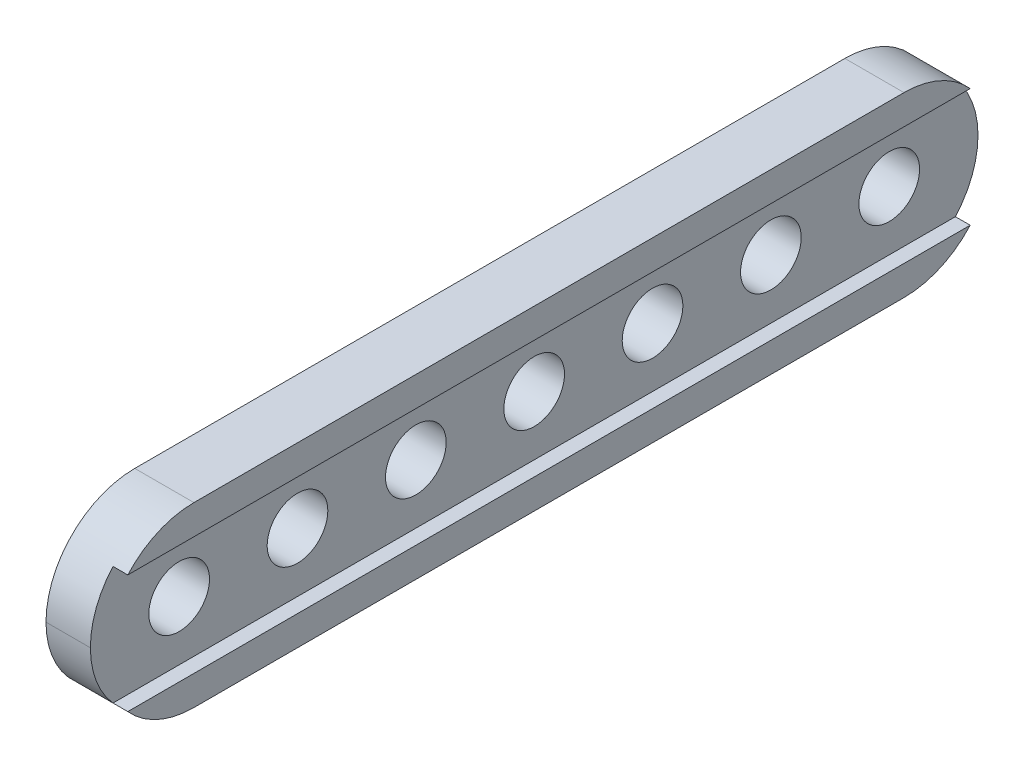
ISO-10303-21;
HEADER;
FILE_DESCRIPTION(('STEP AP214'),'2;1');
FILE_NAME('part.step','',(''),(''),'','','');
FILE_SCHEMA(('AUTOMOTIVE_DESIGN { 1 0 10303 214 1 1 1 1 }'));
ENDSEC;
DATA;
#1=APPLICATION_CONTEXT('core data for automotive mechanical design processes');
#2=APPLICATION_PROTOCOL_DEFINITION('international standard','automotive_design',2000,#1);
#3=PRODUCT_CONTEXT('',#1,'mechanical');
#4=PRODUCT('Part','Part','',(#3));
#5=PRODUCT_RELATED_PRODUCT_CATEGORY('part','',(#4));
#6=PRODUCT_DEFINITION_FORMATION('','',#4);
#7=PRODUCT_DEFINITION_CONTEXT('part definition',#1,'design');
#8=PRODUCT_DEFINITION('design','',#6,#7);
#9=PRODUCT_DEFINITION_SHAPE('','',#8);
#10=(LENGTH_UNIT() NAMED_UNIT(*) SI_UNIT(.MILLI.,.METRE.));
#11=(NAMED_UNIT(*) PLANE_ANGLE_UNIT() SI_UNIT($,.RADIAN.));
#12=(NAMED_UNIT(*) SI_UNIT($,.STERADIAN.) SOLID_ANGLE_UNIT());
#13=UNCERTAINTY_MEASURE_WITH_UNIT(LENGTH_MEASURE(1.E-05),#10,'distance_accuracy_value','');
#14=(GEOMETRIC_REPRESENTATION_CONTEXT(3) GLOBAL_UNCERTAINTY_ASSIGNED_CONTEXT((#13)) GLOBAL_UNIT_ASSIGNED_CONTEXT((#10,
#11,#12)) REPRESENTATION_CONTEXT('',''));
#15=CARTESIAN_POINT('',(0.,0.,0.));
#16=DIRECTION('',(0.,0.,1.));
#17=DIRECTION('',(1.,0.,0.));
#18=AXIS2_PLACEMENT_3D('',#15,#16,#17);
#19=CARTESIAN_POINT('',(0.,0.,-60.));
#20=DIRECTION('',(-1.,0.,0.));
#21=DIRECTION('',(0.,-1.,0.));
#22=AXIS2_PLACEMENT_3D('',#19,#20,#21);
#23=PLANE('',#22);
#24=CARTESIAN_POINT('',(0.,6.,-30.));
#25=DIRECTION('',(-1.,0.,0.));
#26=DIRECTION('',(0.,-1.,0.));
#27=AXIS2_PLACEMENT_3D('',#24,#25,#26);
#28=CIRCLE('',#27,2.05);
#29=CARTESIAN_POINT('',(0.,3.95,-30.));
#30=VERTEX_POINT('',#29);
#31=EDGE_CURVE('E11',#30,#30,#28,.T.);
#32=ORIENTED_EDGE('',*,*,#31,.F.);
#33=EDGE_LOOP('',(#32));
#34=FACE_BOUND('',#33,.T.);
#35=CARTESIAN_POINT('',(0.,6.,-38.));
#36=DIRECTION('',(-1.,0.,0.));
#37=DIRECTION('',(0.,-1.,0.));
#38=AXIS2_PLACEMENT_3D('',#35,#36,#37);
#39=CIRCLE('',#38,2.05);
#40=CARTESIAN_POINT('',(0.,3.95,-38.));
#41=VERTEX_POINT('',#40);
#42=EDGE_CURVE('E182',#41,#41,#39,.T.);
#43=ORIENTED_EDGE('',*,*,#42,.F.);
#44=EDGE_LOOP('',(#43));
#45=FACE_BOUND('',#44,.T.);
#46=CARTESIAN_POINT('',(0.,6.,-6.));
#47=DIRECTION('',(-1.,0.,0.));
#48=DIRECTION('',(0.,-1.,0.));
#49=AXIS2_PLACEMENT_3D('',#46,#47,#48);
#50=CIRCLE('',#49,6.);
#51=CARTESIAN_POINT('',(0.,0.,-6.));
#52=VERTEX_POINT('',#51);
#53=CARTESIAN_POINT('',(0.,6.,0.));
#54=VERTEX_POINT('',#53);
#55=EDGE_CURVE('E115',#52,#54,#50,.T.);
#56=ORIENTED_EDGE('',*,*,#55,.T.);
#57=CARTESIAN_POINT('',(0.,6.,-6.));
#58=DIRECTION('',(-1.,0.,0.));
#59=DIRECTION('',(0.,-1.,0.));
#60=AXIS2_PLACEMENT_3D('',#57,#58,#59);
#61=CIRCLE('',#60,6.);
#62=CARTESIAN_POINT('',(0.,12.,-6.));
#63=VERTEX_POINT('',#62);
#64=EDGE_CURVE('E120',#54,#63,#61,.T.);
#65=ORIENTED_EDGE('',*,*,#64,.T.);
#66=DIRECTION('',(0.,0.,1.));
#67=VECTOR('',#66,1.);
#68=CARTESIAN_POINT('',(0.,12.,-60.));
#69=LINE('',#68,#67);
#70=CARTESIAN_POINT('',(0.,12.,-54.));
#71=VERTEX_POINT('',#70);
#72=EDGE_CURVE('E213',#71,#63,#69,.T.);
#73=ORIENTED_EDGE('',*,*,#72,.F.);
#74=CARTESIAN_POINT('',(0.,6.,-54.));
#75=DIRECTION('',(-1.,0.,0.));
#76=DIRECTION('',(0.,-1.,0.));
#77=AXIS2_PLACEMENT_3D('',#74,#75,#76);
#78=CIRCLE('',#77,6.);
#79=CARTESIAN_POINT('',(0.,6.,-60.));
#80=VERTEX_POINT('',#79);
#81=EDGE_CURVE('E215',#71,#80,#78,.T.);
#82=ORIENTED_EDGE('',*,*,#81,.T.);
#83=CARTESIAN_POINT('',(0.,6.,-54.));
#84=DIRECTION('',(-1.,0.,0.));
#85=DIRECTION('',(0.,-1.,0.));
#86=AXIS2_PLACEMENT_3D('',#83,#84,#85);
#87=CIRCLE('',#86,6.);
#88=CARTESIAN_POINT('',(0.,0.,-54.));
#89=VERTEX_POINT('',#88);
#90=EDGE_CURVE('E126',#80,#89,#87,.T.);
#91=ORIENTED_EDGE('',*,*,#90,.T.);
#92=DIRECTION('',(0.,0.,1.));
#93=VECTOR('',#92,1.);
#94=CARTESIAN_POINT('',(0.,0.,-60.));
#95=LINE('',#94,#93);
#96=EDGE_CURVE('E123',#89,#52,#95,.T.);
#97=ORIENTED_EDGE('',*,*,#96,.T.);
#98=EDGE_LOOP('',(#56,#65,#73,#82,#91,#97));
#99=FACE_BOUND('',#98,.T.);
#100=CARTESIAN_POINT('',(0.,6.,-54.));
#101=DIRECTION('',(-1.,0.,0.));
#102=DIRECTION('',(0.,-1.,0.));
#103=AXIS2_PLACEMENT_3D('',#100,#101,#102);
#104=CIRCLE('',#103,2.05);
#105=CARTESIAN_POINT('',(0.,3.95,-54.));
#106=VERTEX_POINT('',#105);
#107=EDGE_CURVE('E179',#106,#106,#104,.T.);
#108=ORIENTED_EDGE('',*,*,#107,.F.);
#109=EDGE_LOOP('',(#108));
#110=FACE_BOUND('',#109,.T.);
#111=CARTESIAN_POINT('',(0.,6.,-46.));
#112=DIRECTION('',(-1.,0.,0.));
#113=DIRECTION('',(0.,-1.,0.));
#114=AXIS2_PLACEMENT_3D('',#111,#112,#113);
#115=CIRCLE('',#114,2.05);
#116=CARTESIAN_POINT('',(0.,3.95,-46.));
#117=VERTEX_POINT('',#116);
#118=EDGE_CURVE('E208',#117,#117,#115,.T.);
#119=ORIENTED_EDGE('',*,*,#118,.F.);
#120=EDGE_LOOP('',(#119));
#121=FACE_BOUND('',#120,.T.);
#122=CARTESIAN_POINT('',(0.,6.,-6.));
#123=DIRECTION('',(1.,0.,0.));
#124=DIRECTION('',(0.,-1.,0.));
#125=AXIS2_PLACEMENT_3D('',#122,#123,#124);
#126=CIRCLE('',#125,2.05);
#127=CARTESIAN_POINT('',(0.,3.95,-6.));
#128=VERTEX_POINT('',#127);
#129=EDGE_CURVE('E190',#128,#128,#126,.T.);
#130=ORIENTED_EDGE('',*,*,#129,.T.);
#131=EDGE_LOOP('',(#130));
#132=FACE_BOUND('',#131,.T.);
#133=CARTESIAN_POINT('',(0.,6.,-14.));
#134=DIRECTION('',(1.,0.,0.));
#135=DIRECTION('',(0.,-1.,0.));
#136=AXIS2_PLACEMENT_3D('',#133,#134,#135);
#137=CIRCLE('',#136,2.05);
#138=CARTESIAN_POINT('',(0.,3.95,-14.));
#139=VERTEX_POINT('',#138);
#140=EDGE_CURVE('E193',#139,#139,#137,.T.);
#141=ORIENTED_EDGE('',*,*,#140,.T.);
#142=EDGE_LOOP('',(#141));
#143=FACE_BOUND('',#142,.T.);
#144=CARTESIAN_POINT('',(0.,6.,-22.));
#145=DIRECTION('',(1.,0.,0.));
#146=DIRECTION('',(0.,-1.,0.));
#147=AXIS2_PLACEMENT_3D('',#144,#145,#146);
#148=CIRCLE('',#147,2.05);
#149=CARTESIAN_POINT('',(0.,3.95,-22.));
#150=VERTEX_POINT('',#149);
#151=EDGE_CURVE('E203',#150,#150,#148,.T.);
#152=ORIENTED_EDGE('',*,*,#151,.T.);
#153=EDGE_LOOP('',(#152));
#154=FACE_BOUND('',#153,.T.);
#155=ADVANCED_FACE('F33',(#34,#45,#99,#110,#121,#132,#143,#154),#23,.T.);
#156=CARTESIAN_POINT('',(3.,10.,-60.));
#157=DIRECTION('',(1.,0.,0.));
#158=DIRECTION('',(0.,1.,0.));
#159=AXIS2_PLACEMENT_3D('',#156,#157,#158);
#160=PLANE('',#159);
#161=CARTESIAN_POINT('',(3.,6.,-30.));
#162=DIRECTION('',(1.,0.,0.));
#163=DIRECTION('',(0.,1.,0.));
#164=AXIS2_PLACEMENT_3D('',#161,#162,#163);
#165=CIRCLE('',#164,2.05);
#166=CARTESIAN_POINT('',(3.,8.05,-30.));
#167=VERTEX_POINT('',#166);
#168=EDGE_CURVE('E42',#167,#167,#165,.T.);
#169=ORIENTED_EDGE('',*,*,#168,.F.);
#170=EDGE_LOOP('',(#169));
#171=FACE_BOUND('',#170,.T.);
#172=CARTESIAN_POINT('',(3.,6.,-38.));
#173=DIRECTION('',(1.,0.,0.));
#174=DIRECTION('',(0.,1.,0.));
#175=AXIS2_PLACEMENT_3D('',#172,#173,#174);
#176=CIRCLE('',#175,2.05);
#177=CARTESIAN_POINT('',(3.,8.05,-38.));
#178=VERTEX_POINT('',#177);
#179=EDGE_CURVE('E172',#178,#178,#176,.T.);
#180=ORIENTED_EDGE('',*,*,#179,.F.);
#181=EDGE_LOOP('',(#180));
#182=FACE_BOUND('',#181,.T.);
#183=DIRECTION('',(0.,0.,1.));
#184=VECTOR('',#183,1.);
#185=CARTESIAN_POINT('',(3.,10.,-60.));
#186=LINE('',#185,#184);
#187=CARTESIAN_POINT('',(3.,10.,-58.4721359549996));
#188=VERTEX_POINT('',#187);
#189=CARTESIAN_POINT('',(3.,10.,-1.52786404500042));
#190=VERTEX_POINT('',#189);
#191=EDGE_CURVE('E222',#188,#190,#186,.T.);
#192=ORIENTED_EDGE('',*,*,#191,.T.);
#193=CARTESIAN_POINT('',(3.,6.,-6.));
#194=DIRECTION('',(1.,0.,0.));
#195=DIRECTION('',(0.,1.,0.));
#196=AXIS2_PLACEMENT_3D('',#193,#194,#195);
#197=CIRCLE('',#196,6.);
#198=CARTESIAN_POINT('',(3.,6.,0.));
#199=VERTEX_POINT('',#198);
#200=EDGE_CURVE('E161',#190,#199,#197,.T.);
#201=ORIENTED_EDGE('',*,*,#200,.T.);
#202=CARTESIAN_POINT('',(3.,6.,-6.));
#203=DIRECTION('',(1.,0.,0.));
#204=DIRECTION('',(0.,1.,0.));
#205=AXIS2_PLACEMENT_3D('',#202,#203,#204);
#206=CIRCLE('',#205,6.);
#207=CARTESIAN_POINT('',(3.,2.,-1.52786404500042));
#208=VERTEX_POINT('',#207);
#209=EDGE_CURVE('E133',#199,#208,#206,.T.);
#210=ORIENTED_EDGE('',*,*,#209,.T.);
#211=DIRECTION('',(0.,0.,1.));
#212=VECTOR('',#211,1.);
#213=CARTESIAN_POINT('',(3.,2.,-60.));
#214=LINE('',#213,#212);
#215=CARTESIAN_POINT('',(3.,2.,-58.4721359549996));
#216=VERTEX_POINT('',#215);
#217=EDGE_CURVE('E225',#216,#208,#214,.T.);
#218=ORIENTED_EDGE('',*,*,#217,.F.);
#219=CARTESIAN_POINT('',(3.,6.,-54.));
#220=DIRECTION('',(1.,0.,0.));
#221=DIRECTION('',(0.,1.,0.));
#222=AXIS2_PLACEMENT_3D('',#219,#220,#221);
#223=CIRCLE('',#222,6.);
#224=CARTESIAN_POINT('',(3.,6.,-60.));
#225=VERTEX_POINT('',#224);
#226=EDGE_CURVE('E158',#216,#225,#223,.T.);
#227=ORIENTED_EDGE('',*,*,#226,.T.);
#228=CARTESIAN_POINT('',(3.,6.,-54.));
#229=DIRECTION('',(1.,0.,0.));
#230=DIRECTION('',(0.,1.,0.));
#231=AXIS2_PLACEMENT_3D('',#228,#229,#230);
#232=CIRCLE('',#231,6.);
#233=EDGE_CURVE('E156',#225,#188,#232,.T.);
#234=ORIENTED_EDGE('',*,*,#233,.T.);
#235=EDGE_LOOP('',(#192,#201,#210,#218,#227,#234));
#236=FACE_BOUND('',#235,.T.);
#237=CARTESIAN_POINT('',(3.,6.,-54.));
#238=DIRECTION('',(1.,0.,0.));
#239=DIRECTION('',(0.,1.,0.));
#240=AXIS2_PLACEMENT_3D('',#237,#238,#239);
#241=CIRCLE('',#240,2.05);
#242=CARTESIAN_POINT('',(3.,8.05,-54.));
#243=VERTEX_POINT('',#242);
#244=EDGE_CURVE('E176',#243,#243,#241,.T.);
#245=ORIENTED_EDGE('',*,*,#244,.F.);
#246=EDGE_LOOP('',(#245));
#247=FACE_BOUND('',#246,.T.);
#248=CARTESIAN_POINT('',(3.,6.,-46.));
#249=DIRECTION('',(1.,0.,0.));
#250=DIRECTION('',(0.,1.,0.));
#251=AXIS2_PLACEMENT_3D('',#248,#249,#250);
#252=CIRCLE('',#251,2.05);
#253=CARTESIAN_POINT('',(3.,8.05,-46.));
#254=VERTEX_POINT('',#253);
#255=EDGE_CURVE('E189',#254,#254,#252,.T.);
#256=ORIENTED_EDGE('',*,*,#255,.F.);
#257=EDGE_LOOP('',(#256));
#258=FACE_BOUND('',#257,.T.);
#259=CARTESIAN_POINT('',(3.,6.,-6.));
#260=DIRECTION('',(1.,0.,0.));
#261=DIRECTION('',(0.,1.,0.));
#262=AXIS2_PLACEMENT_3D('',#259,#260,#261);
#263=CIRCLE('',#262,2.05);
#264=CARTESIAN_POINT('',(3.,8.05,-6.));
#265=VERTEX_POINT('',#264);
#266=EDGE_CURVE('E187',#265,#265,#263,.F.);
#267=ORIENTED_EDGE('',*,*,#266,.T.);
#268=EDGE_LOOP('',(#267));
#269=FACE_BOUND('',#268,.T.);
#270=CARTESIAN_POINT('',(3.,6.,-14.));
#271=DIRECTION('',(1.,0.,0.));
#272=DIRECTION('',(0.,1.,0.));
#273=AXIS2_PLACEMENT_3D('',#270,#271,#272);
#274=CIRCLE('',#273,2.05);
#275=CARTESIAN_POINT('',(3.,8.05,-14.));
#276=VERTEX_POINT('',#275);
#277=EDGE_CURVE('E191',#276,#276,#274,.F.);
#278=ORIENTED_EDGE('',*,*,#277,.T.);
#279=EDGE_LOOP('',(#278));
#280=FACE_BOUND('',#279,.T.);
#281=CARTESIAN_POINT('',(3.,6.,-22.));
#282=DIRECTION('',(1.,0.,0.));
#283=DIRECTION('',(0.,1.,0.));
#284=AXIS2_PLACEMENT_3D('',#281,#282,#283);
#285=CIRCLE('',#284,2.05);
#286=CARTESIAN_POINT('',(3.,8.05,-22.));
#287=VERTEX_POINT('',#286);
#288=EDGE_CURVE('E37',#287,#287,#285,.F.);
#289=ORIENTED_EDGE('',*,*,#288,.T.);
#290=EDGE_LOOP('',(#289));
#291=FACE_BOUND('',#290,.T.);
#292=ADVANCED_FACE('F254',(#171,#182,#236,#247,#258,#269,#280,#291),#160,.T.);
#293=CARTESIAN_POINT('',(4.,6.,-30.));
#294=DIRECTION('',(-1.,0.,0.));
#295=DIRECTION('',(0.,-1.,0.));
#296=AXIS2_PLACEMENT_3D('',#293,#294,#295);
#297=CYLINDRICAL_SURFACE('',#296,2.05);
#298=ORIENTED_EDGE('',*,*,#168,.T.);
#299=EDGE_LOOP('',(#298));
#300=FACE_BOUND('',#299,.T.);
#301=ORIENTED_EDGE('',*,*,#31,.T.);
#302=EDGE_LOOP('',(#301));
#303=FACE_BOUND('',#302,.T.);
#304=ADVANCED_FACE('F35',(#300,#303),#297,.F.);
#305=CARTESIAN_POINT('',(4.,6.,-38.));
#306=DIRECTION('',(-1.,0.,0.));
#307=DIRECTION('',(0.,-1.,0.));
#308=AXIS2_PLACEMENT_3D('',#305,#306,#307);
#309=CYLINDRICAL_SURFACE('',#308,2.05);
#310=ORIENTED_EDGE('',*,*,#179,.T.);
#311=EDGE_LOOP('',(#310));
#312=FACE_BOUND('',#311,.T.);
#313=ORIENTED_EDGE('',*,*,#42,.T.);
#314=EDGE_LOOP('',(#313));
#315=FACE_BOUND('',#314,.T.);
#316=ADVANCED_FACE('F293',(#312,#315),#309,.F.);
#317=CARTESIAN_POINT('',(0.,12.,-60.));
#318=DIRECTION('',(0.,1.,0.));
#319=DIRECTION('',(0.,0.,1.));
#320=AXIS2_PLACEMENT_3D('',#317,#318,#319);
#321=PLANE('',#320);
#322=ORIENTED_EDGE('',*,*,#72,.T.);
#323=DIRECTION('',(-1.,0.,0.));
#324=VECTOR('',#323,1.);
#325=CARTESIAN_POINT('',(4.,12.,-6.));
#326=LINE('',#325,#324);
#327=CARTESIAN_POINT('',(4.,12.,-6.));
#328=VERTEX_POINT('',#327);
#329=EDGE_CURVE('E141',#63,#328,#326,.F.);
#330=ORIENTED_EDGE('',*,*,#329,.T.);
#331=DIRECTION('',(0.,0.,1.));
#332=VECTOR('',#331,1.);
#333=CARTESIAN_POINT('',(4.,12.,-60.));
#334=LINE('',#333,#332);
#335=CARTESIAN_POINT('',(4.,12.,-54.));
#336=VERTEX_POINT('',#335);
#337=EDGE_CURVE('E216',#336,#328,#334,.T.);
#338=ORIENTED_EDGE('',*,*,#337,.F.);
#339=DIRECTION('',(-1.,0.,0.));
#340=VECTOR('',#339,1.);
#341=CARTESIAN_POINT('',(0.,12.,-54.));
#342=LINE('',#341,#340);
#343=EDGE_CURVE('E142',#336,#71,#342,.T.);
#344=ORIENTED_EDGE('',*,*,#343,.T.);
#345=EDGE_LOOP('',(#322,#330,#338,#344));
#346=FACE_BOUND('',#345,.T.);
#347=ADVANCED_FACE('F290',(#346),#321,.T.);
#348=CARTESIAN_POINT('',(4.,10.,-60.));
#349=DIRECTION('',(1.,0.,0.));
#350=DIRECTION('',(0.,1.,0.));
#351=AXIS2_PLACEMENT_3D('',#348,#349,#350);
#352=PLANE('',#351);
#353=ORIENTED_EDGE('',*,*,#337,.T.);
#354=CARTESIAN_POINT('',(4.,6.,-6.));
#355=DIRECTION('',(1.,0.,0.));
#356=DIRECTION('',(0.,1.,0.));
#357=AXIS2_PLACEMENT_3D('',#354,#355,#356);
#358=CIRCLE('',#357,6.);
#359=CARTESIAN_POINT('',(4.,10.,-1.52786404500042));
#360=VERTEX_POINT('',#359);
#361=EDGE_CURVE('E150',#328,#360,#358,.T.);
#362=ORIENTED_EDGE('',*,*,#361,.T.);
#363=DIRECTION('',(0.,0.,1.));
#364=VECTOR('',#363,1.);
#365=CARTESIAN_POINT('',(4.,10.,-60.));
#366=LINE('',#365,#364);
#367=CARTESIAN_POINT('',(4.,10.,-58.4721359549996));
#368=VERTEX_POINT('',#367);
#369=EDGE_CURVE('E219',#368,#360,#366,.T.);
#370=ORIENTED_EDGE('',*,*,#369,.F.);
#371=CARTESIAN_POINT('',(4.,6.,-54.));
#372=DIRECTION('',(1.,0.,0.));
#373=DIRECTION('',(0.,1.,0.));
#374=AXIS2_PLACEMENT_3D('',#371,#372,#373);
#375=CIRCLE('',#374,6.);
#376=EDGE_CURVE('E148',#368,#336,#375,.T.);
#377=ORIENTED_EDGE('',*,*,#376,.T.);
#378=EDGE_LOOP('',(#353,#362,#370,#377));
#379=FACE_BOUND('',#378,.T.);
#380=ADVANCED_FACE('F286',(#379),#352,.T.);
#381=CARTESIAN_POINT('',(4.,10.,-60.));
#382=DIRECTION('',(0.,-1.,0.));
#383=DIRECTION('',(1.,0.,0.));
#384=AXIS2_PLACEMENT_3D('',#381,#382,#383);
#385=PLANE('',#384);
#386=ORIENTED_EDGE('',*,*,#369,.T.);
#387=DIRECTION('',(1.,0.,0.));
#388=VECTOR('',#387,1.);
#389=CARTESIAN_POINT('',(4.,10.,-1.52786404500042));
#390=LINE('',#389,#388);
#391=EDGE_CURVE('E154',#360,#190,#390,.F.);
#392=ORIENTED_EDGE('',*,*,#391,.T.);
#393=ORIENTED_EDGE('',*,*,#191,.F.);
#394=DIRECTION('',(-1.,0.,0.));
#395=VECTOR('',#394,1.);
#396=CARTESIAN_POINT('',(3.,10.,-58.4721359549996));
#397=LINE('',#396,#395);
#398=EDGE_CURVE('E152',#188,#368,#397,.F.);
#399=ORIENTED_EDGE('',*,*,#398,.T.);
#400=EDGE_LOOP('',(#386,#392,#393,#399));
#401=FACE_BOUND('',#400,.T.);
#402=ADVANCED_FACE('F280',(#401),#385,.T.);
#403=CARTESIAN_POINT('',(4.,2.,-60.));
#404=DIRECTION('',(0.,1.,0.));
#405=DIRECTION('',(-1.,0.,0.));
#406=AXIS2_PLACEMENT_3D('',#403,#404,#405);
#407=PLANE('',#406);
#408=ORIENTED_EDGE('',*,*,#217,.T.);
#409=DIRECTION('',(-1.,0.,0.));
#410=VECTOR('',#409,1.);
#411=CARTESIAN_POINT('',(3.,2.,-1.52786404500042));
#412=LINE('',#411,#410);
#413=CARTESIAN_POINT('',(4.,2.,-1.52786404500042));
#414=VERTEX_POINT('',#413);
#415=EDGE_CURVE('E165',#208,#414,#412,.F.);
#416=ORIENTED_EDGE('',*,*,#415,.T.);
#417=DIRECTION('',(0.,0.,1.));
#418=VECTOR('',#417,1.);
#419=CARTESIAN_POINT('',(4.,2.,-60.));
#420=LINE('',#419,#418);
#421=CARTESIAN_POINT('',(4.,2.,-58.4721359549996));
#422=VERTEX_POINT('',#421);
#423=EDGE_CURVE('E228',#422,#414,#420,.T.);
#424=ORIENTED_EDGE('',*,*,#423,.F.);
#425=DIRECTION('',(1.,0.,0.));
#426=VECTOR('',#425,1.);
#427=CARTESIAN_POINT('',(4.,2.,-58.4721359549996));
#428=LINE('',#427,#426);
#429=EDGE_CURVE('E163',#422,#216,#428,.F.);
#430=ORIENTED_EDGE('',*,*,#429,.T.);
#431=EDGE_LOOP('',(#408,#416,#424,#430));
#432=FACE_BOUND('',#431,.T.);
#433=ADVANCED_FACE('F276',(#432),#407,.T.);
#434=CARTESIAN_POINT('',(4.,0.,-60.));
#435=DIRECTION('',(1.,0.,0.));
#436=DIRECTION('',(0.,1.,0.));
#437=AXIS2_PLACEMENT_3D('',#434,#435,#436);
#438=PLANE('',#437);
#439=ORIENTED_EDGE('',*,*,#423,.T.);
#440=CARTESIAN_POINT('',(4.,6.,-6.));
#441=DIRECTION('',(1.,0.,0.));
#442=DIRECTION('',(0.,1.,0.));
#443=AXIS2_PLACEMENT_3D('',#440,#441,#442);
#444=CIRCLE('',#443,6.);
#445=CARTESIAN_POINT('',(4.,0.,-6.));
#446=VERTEX_POINT('',#445);
#447=EDGE_CURVE('E50',#414,#446,#444,.T.);
#448=ORIENTED_EDGE('',*,*,#447,.T.);
#449=DIRECTION('',(0.,0.,1.));
#450=VECTOR('',#449,1.);
#451=CARTESIAN_POINT('',(4.,0.,-60.));
#452=LINE('',#451,#450);
#453=CARTESIAN_POINT('',(4.,0.,-54.));
#454=VERTEX_POINT('',#453);
#455=EDGE_CURVE('E230',#454,#446,#452,.T.);
#456=ORIENTED_EDGE('',*,*,#455,.F.);
#457=CARTESIAN_POINT('',(4.,6.,-54.));
#458=DIRECTION('',(1.,0.,0.));
#459=DIRECTION('',(0.,1.,0.));
#460=AXIS2_PLACEMENT_3D('',#457,#458,#459);
#461=CIRCLE('',#460,6.);
#462=EDGE_CURVE('E58',#454,#422,#461,.T.);
#463=ORIENTED_EDGE('',*,*,#462,.T.);
#464=EDGE_LOOP('',(#439,#448,#456,#463));
#465=FACE_BOUND('',#464,.T.);
#466=ADVANCED_FACE('F272',(#465),#438,.T.);
#467=CARTESIAN_POINT('',(0.,0.,-60.));
#468=DIRECTION('',(0.,-1.,0.));
#469=DIRECTION('',(0.,0.,-1.));
#470=AXIS2_PLACEMENT_3D('',#467,#468,#469);
#471=PLANE('',#470);
#472=ORIENTED_EDGE('',*,*,#455,.T.);
#473=DIRECTION('',(1.,0.,0.));
#474=VECTOR('',#473,1.);
#475=CARTESIAN_POINT('',(0.,0.,-6.));
#476=LINE('',#475,#474);
#477=EDGE_CURVE('E171',#446,#52,#476,.F.);
#478=ORIENTED_EDGE('',*,*,#477,.T.);
#479=ORIENTED_EDGE('',*,*,#96,.F.);
#480=DIRECTION('',(1.,0.,0.));
#481=VECTOR('',#480,1.);
#482=CARTESIAN_POINT('',(0.,0.,-54.));
#483=LINE('',#482,#481);
#484=EDGE_CURVE('E169',#89,#454,#483,.T.);
#485=ORIENTED_EDGE('',*,*,#484,.T.);
#486=EDGE_LOOP('',(#472,#478,#479,#485));
#487=FACE_BOUND('',#486,.T.);
#488=ADVANCED_FACE('F237',(#487),#471,.T.);
#489=CARTESIAN_POINT('',(0.,6.,-6.));
#490=DIRECTION('',(-1.,0.,0.));
#491=DIRECTION('',(0.,0.,1.));
#492=AXIS2_PLACEMENT_3D('',#489,#490,#491);
#493=CYLINDRICAL_SURFACE('',#492,6.);
#494=ORIENTED_EDGE('',*,*,#415,.F.);
#495=ORIENTED_EDGE('',*,*,#209,.F.);
#496=DIRECTION('',(1.,0.,0.));
#497=VECTOR('',#496,1.);
#498=CARTESIAN_POINT('',(4.,6.,0.));
#499=LINE('',#498,#497);
#500=EDGE_CURVE('E130',#54,#199,#499,.T.);
#501=ORIENTED_EDGE('',*,*,#500,.F.);
#502=ORIENTED_EDGE('',*,*,#55,.F.);
#503=ORIENTED_EDGE('',*,*,#477,.F.);
#504=ORIENTED_EDGE('',*,*,#447,.F.);
#505=EDGE_LOOP('',(#494,#495,#501,#502,#503,#504));
#506=FACE_BOUND('',#505,.T.);
#507=ADVANCED_FACE('F132',(#506),#493,.T.);
#508=CARTESIAN_POINT('',(0.,6.,-6.));
#509=DIRECTION('',(1.,0.,0.));
#510=DIRECTION('',(0.,0.,-1.));
#511=AXIS2_PLACEMENT_3D('',#508,#509,#510);
#512=CYLINDRICAL_SURFACE('',#511,6.);
#513=ORIENTED_EDGE('',*,*,#361,.F.);
#514=ORIENTED_EDGE('',*,*,#329,.F.);
#515=ORIENTED_EDGE('',*,*,#64,.F.);
#516=ORIENTED_EDGE('',*,*,#500,.T.);
#517=ORIENTED_EDGE('',*,*,#200,.F.);
#518=ORIENTED_EDGE('',*,*,#391,.F.);
#519=EDGE_LOOP('',(#513,#514,#515,#516,#517,#518));
#520=FACE_BOUND('',#519,.T.);
#521=ADVANCED_FACE('F139',(#520),#512,.T.);
#522=CARTESIAN_POINT('',(0.,6.,-54.));
#523=DIRECTION('',(-1.,0.,0.));
#524=DIRECTION('',(0.,0.,1.));
#525=AXIS2_PLACEMENT_3D('',#522,#523,#524);
#526=CYLINDRICAL_SURFACE('',#525,6.);
#527=DIRECTION('',(-1.,0.,0.));
#528=VECTOR('',#527,1.);
#529=CARTESIAN_POINT('',(0.,6.,-60.));
#530=LINE('',#529,#528);
#531=EDGE_CURVE('E136',#80,#225,#530,.F.);
#532=ORIENTED_EDGE('',*,*,#531,.F.);
#533=ORIENTED_EDGE('',*,*,#81,.F.);
#534=ORIENTED_EDGE('',*,*,#343,.F.);
#535=ORIENTED_EDGE('',*,*,#376,.F.);
#536=ORIENTED_EDGE('',*,*,#398,.F.);
#537=ORIENTED_EDGE('',*,*,#233,.F.);
#538=EDGE_LOOP('',(#532,#533,#534,#535,#536,#537));
#539=FACE_BOUND('',#538,.T.);
#540=ADVANCED_FACE('F241',(#539),#526,.T.);
#541=CARTESIAN_POINT('',(0.,6.,-54.));
#542=DIRECTION('',(1.,0.,0.));
#543=DIRECTION('',(0.,0.,-1.));
#544=AXIS2_PLACEMENT_3D('',#541,#542,#543);
#545=CYLINDRICAL_SURFACE('',#544,6.);
#546=ORIENTED_EDGE('',*,*,#90,.F.);
#547=ORIENTED_EDGE('',*,*,#531,.T.);
#548=ORIENTED_EDGE('',*,*,#226,.F.);
#549=ORIENTED_EDGE('',*,*,#429,.F.);
#550=ORIENTED_EDGE('',*,*,#462,.F.);
#551=ORIENTED_EDGE('',*,*,#484,.F.);
#552=EDGE_LOOP('',(#546,#547,#548,#549,#550,#551));
#553=FACE_BOUND('',#552,.T.);
#554=ADVANCED_FACE('F238',(#553),#545,.T.);
#555=CARTESIAN_POINT('',(4.,6.,-54.));
#556=DIRECTION('',(-1.,0.,0.));
#557=DIRECTION('',(0.,-1.,0.));
#558=AXIS2_PLACEMENT_3D('',#555,#556,#557);
#559=CYLINDRICAL_SURFACE('',#558,2.05);
#560=ORIENTED_EDGE('',*,*,#244,.T.);
#561=EDGE_LOOP('',(#560));
#562=FACE_BOUND('',#561,.T.);
#563=ORIENTED_EDGE('',*,*,#107,.T.);
#564=EDGE_LOOP('',(#563));
#565=FACE_BOUND('',#564,.T.);
#566=ADVANCED_FACE('F240',(#562,#565),#559,.F.);
#567=CARTESIAN_POINT('',(4.,6.,-46.));
#568=DIRECTION('',(-1.,0.,0.));
#569=DIRECTION('',(0.,-1.,0.));
#570=AXIS2_PLACEMENT_3D('',#567,#568,#569);
#571=CYLINDRICAL_SURFACE('',#570,2.05);
#572=ORIENTED_EDGE('',*,*,#255,.T.);
#573=EDGE_LOOP('',(#572));
#574=FACE_BOUND('',#573,.T.);
#575=ORIENTED_EDGE('',*,*,#118,.T.);
#576=EDGE_LOOP('',(#575));
#577=FACE_BOUND('',#576,.T.);
#578=ADVANCED_FACE('F247',(#574,#577),#571,.F.);
#579=CARTESIAN_POINT('',(4.,6.,-6.));
#580=DIRECTION('',(-1.,0.,0.));
#581=DIRECTION('',(0.,-1.,0.));
#582=AXIS2_PLACEMENT_3D('',#579,#580,#581);
#583=CYLINDRICAL_SURFACE('',#582,2.05);
#584=ORIENTED_EDGE('',*,*,#266,.F.);
#585=EDGE_LOOP('',(#584));
#586=FACE_BOUND('',#585,.T.);
#587=ORIENTED_EDGE('',*,*,#129,.F.);
#588=EDGE_LOOP('',(#587));
#589=FACE_BOUND('',#588,.T.);
#590=ADVANCED_FACE('F298',(#586,#589),#583,.F.);
#591=CARTESIAN_POINT('',(4.,6.,-14.));
#592=DIRECTION('',(-1.,0.,0.));
#593=DIRECTION('',(0.,-1.,0.));
#594=AXIS2_PLACEMENT_3D('',#591,#592,#593);
#595=CYLINDRICAL_SURFACE('',#594,2.05);
#596=ORIENTED_EDGE('',*,*,#277,.F.);
#597=EDGE_LOOP('',(#596));
#598=FACE_BOUND('',#597,.T.);
#599=ORIENTED_EDGE('',*,*,#140,.F.);
#600=EDGE_LOOP('',(#599));
#601=FACE_BOUND('',#600,.T.);
#602=ADVANCED_FACE('F302',(#598,#601),#595,.F.);
#603=CARTESIAN_POINT('',(4.,6.,-22.));
#604=DIRECTION('',(-1.,0.,0.));
#605=DIRECTION('',(0.,-1.,0.));
#606=AXIS2_PLACEMENT_3D('',#603,#604,#605);
#607=CYLINDRICAL_SURFACE('',#606,2.05);
#608=ORIENTED_EDGE('',*,*,#288,.F.);
#609=EDGE_LOOP('',(#608));
#610=FACE_BOUND('',#609,.T.);
#611=ORIENTED_EDGE('',*,*,#151,.F.);
#612=EDGE_LOOP('',(#611));
#613=FACE_BOUND('',#612,.T.);
#614=ADVANCED_FACE('F306',(#610,#613),#607,.F.);
#615=CLOSED_SHELL('',(#155,#292,#304,#316,#347,#380,#402,#433,#466,#488,#507,#521,#540,#554,
#566,#578,#590,#602,#614));
#616=MANIFOLD_SOLID_BREP('B2',#615);
#617=ADVANCED_BREP_SHAPE_REPRESENTATION('',(#18,#616),#14);
#618=SHAPE_DEFINITION_REPRESENTATION(#9,#617);
ENDSEC;
END-ISO-10303-21;
